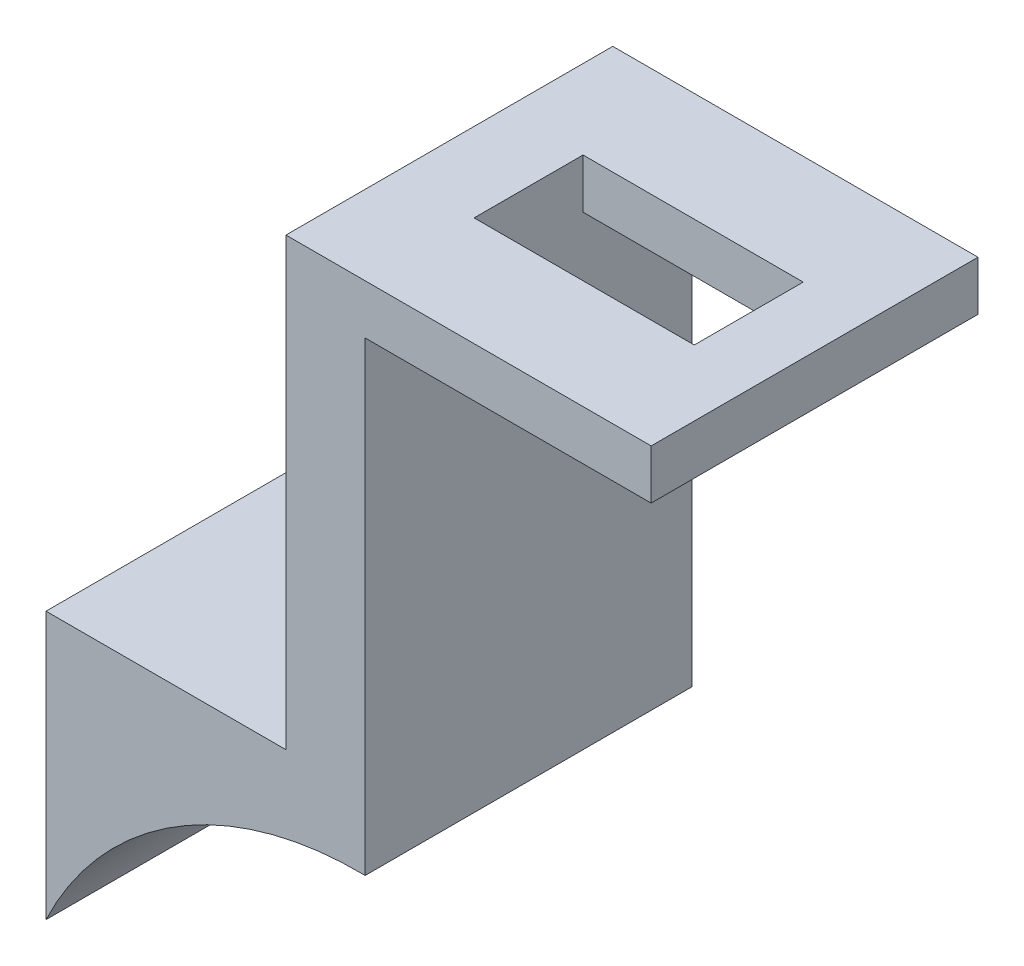
ISO-10303-21;
HEADER;
FILE_DESCRIPTION(('STEP AP214'),'2;1');
FILE_NAME('part.step','',(''),(''),'','','');
FILE_SCHEMA(('AUTOMOTIVE_DESIGN { 1 0 10303 214 1 1 1 1 }'));
ENDSEC;
DATA;
#1=APPLICATION_CONTEXT('core data for automotive mechanical design processes');
#2=APPLICATION_PROTOCOL_DEFINITION('international standard','automotive_design',2000,#1);
#3=PRODUCT_CONTEXT('',#1,'mechanical');
#4=PRODUCT('Part','Part','',(#3));
#5=PRODUCT_RELATED_PRODUCT_CATEGORY('part','',(#4));
#6=PRODUCT_DEFINITION_FORMATION('','',#4);
#7=PRODUCT_DEFINITION_CONTEXT('part definition',#1,'design');
#8=PRODUCT_DEFINITION('design','',#6,#7);
#9=PRODUCT_DEFINITION_SHAPE('','',#8);
#10=(LENGTH_UNIT() NAMED_UNIT(*) SI_UNIT(.MILLI.,.METRE.));
#11=(NAMED_UNIT(*) PLANE_ANGLE_UNIT() SI_UNIT($,.RADIAN.));
#12=(NAMED_UNIT(*) SI_UNIT($,.STERADIAN.) SOLID_ANGLE_UNIT());
#13=UNCERTAINTY_MEASURE_WITH_UNIT(LENGTH_MEASURE(1.E-05),#10,'distance_accuracy_value','');
#14=(GEOMETRIC_REPRESENTATION_CONTEXT(3) GLOBAL_UNCERTAINTY_ASSIGNED_CONTEXT((#13)) GLOBAL_UNIT_ASSIGNED_CONTEXT((#10,
#11,#12)) REPRESENTATION_CONTEXT('',''));
#15=CARTESIAN_POINT('',(0.,0.,0.));
#16=DIRECTION('',(0.,0.,1.));
#17=DIRECTION('',(1.,0.,0.));
#18=AXIS2_PLACEMENT_3D('',#15,#16,#17);
#19=CARTESIAN_POINT('',(16.5480401789836,14.1976842754044,33.));
#20=DIRECTION('',(0.,1.,0.));
#21=DIRECTION('',(-1.,0.,0.));
#22=AXIS2_PLACEMENT_3D('',#19,#20,#21);
#23=PLANE('',#22);
#24=DIRECTION('',(-1.,0.,0.));
#25=VECTOR('',#24,1.);
#26=CARTESIAN_POINT('',(16.5480401789836,14.1976842754044,22.));
#27=LINE('',#26,#25);
#28=CARTESIAN_POINT('',(9.90054017898359,14.1976842754044,22.));
#29=VERTEX_POINT('',#28);
#30=CARTESIAN_POINT('',(-12.3269598210164,14.1976842754044,22.));
#31=VERTEX_POINT('',#30);
#32=EDGE_CURVE('E220',#29,#31,#27,.T.);
#33=ORIENTED_EDGE('',*,*,#32,.F.);
#34=DIRECTION('',(0.,0.,1.));
#35=VECTOR('',#34,1.);
#36=CARTESIAN_POINT('',(9.90054017898359,14.1976842754044,33.));
#37=LINE('',#36,#35);
#38=CARTESIAN_POINT('',(9.90054017898359,14.1976842754044,11.));
#39=VERTEX_POINT('',#38);
#40=EDGE_CURVE('E231',#39,#29,#37,.T.);
#41=ORIENTED_EDGE('',*,*,#40,.F.);
#42=DIRECTION('',(1.,0.,0.));
#43=VECTOR('',#42,1.);
#44=CARTESIAN_POINT('',(16.5480401789836,14.1976842754044,11.));
#45=LINE('',#44,#43);
#46=CARTESIAN_POINT('',(-12.3269598210164,14.1976842754044,11.));
#47=VERTEX_POINT('',#46);
#48=EDGE_CURVE('E221',#47,#39,#45,.T.);
#49=ORIENTED_EDGE('',*,*,#48,.F.);
#50=DIRECTION('',(0.,0.,-1.));
#51=VECTOR('',#50,1.);
#52=CARTESIAN_POINT('',(-12.3269598210164,14.1976842754044,33.));
#53=LINE('',#52,#51);
#54=CARTESIAN_POINT('',(-12.3269598210164,14.1976842754044,0.));
#55=VERTEX_POINT('',#54);
#56=EDGE_CURVE('E191',#47,#55,#53,.T.);
#57=ORIENTED_EDGE('',*,*,#56,.T.);
#58=DIRECTION('',(1.,0.,0.));
#59=VECTOR('',#58,1.);
#60=CARTESIAN_POINT('',(16.5480401789836,14.1976842754044,0.));
#61=LINE('',#60,#59);
#62=CARTESIAN_POINT('',(16.5480401789836,14.1976842754044,0.));
#63=VERTEX_POINT('',#62);
#64=EDGE_CURVE('E170',#55,#63,#61,.T.);
#65=ORIENTED_EDGE('',*,*,#64,.T.);
#66=DIRECTION('',(0.,0.,-1.));
#67=VECTOR('',#66,1.);
#68=CARTESIAN_POINT('',(16.5480401789836,14.1976842754044,33.));
#69=LINE('',#68,#67);
#70=CARTESIAN_POINT('',(16.5480401789836,14.1976842754044,33.));
#71=VERTEX_POINT('',#70);
#72=EDGE_CURVE('E188',#71,#63,#69,.T.);
#73=ORIENTED_EDGE('',*,*,#72,.F.);
#74=DIRECTION('',(1.,0.,0.));
#75=VECTOR('',#74,1.);
#76=CARTESIAN_POINT('',(16.5480401789836,14.1976842754044,33.));
#77=LINE('',#76,#75);
#78=CARTESIAN_POINT('',(-12.3269598210164,14.1976842754044,33.));
#79=VERTEX_POINT('',#78);
#80=EDGE_CURVE('E248',#79,#71,#77,.T.);
#81=ORIENTED_EDGE('',*,*,#80,.F.);
#82=EDGE_CURVE('E166',#79,#31,#53,.T.);
#83=ORIENTED_EDGE('',*,*,#82,.T.);
#84=EDGE_LOOP('',(#33,#41,#49,#57,#65,#73,#81,#83));
#85=FACE_BOUND('',#84,.T.);
#86=ADVANCED_FACE('F33',(#85),#23,.F.);
#87=CARTESIAN_POINT('',(-20.3269598210164,19.1976842754044,33.));
#88=DIRECTION('',(0.,-1.,0.));
#89=DIRECTION('',(0.,0.,-1.));
#90=AXIS2_PLACEMENT_3D('',#87,#88,#89);
#91=PLANE('',#90);
#92=DIRECTION('',(-1.,0.,0.));
#93=VECTOR('',#92,1.);
#94=CARTESIAN_POINT('',(-20.3269598210164,19.1976842754044,0.));
#95=LINE('',#94,#93);
#96=CARTESIAN_POINT('',(16.5480401789836,19.1976842754044,0.));
#97=VERTEX_POINT('',#96);
#98=CARTESIAN_POINT('',(-20.3269598210164,19.1976842754044,0.));
#99=VERTEX_POINT('',#98);
#100=EDGE_CURVE('E177',#97,#99,#95,.T.);
#101=ORIENTED_EDGE('',*,*,#100,.T.);
#102=DIRECTION('',(0.,0.,-1.));
#103=VECTOR('',#102,1.);
#104=CARTESIAN_POINT('',(-20.3269598210164,19.1976842754044,33.));
#105=LINE('',#104,#103);
#106=CARTESIAN_POINT('',(-20.3269598210164,19.1976842754044,33.));
#107=VERTEX_POINT('',#106);
#108=EDGE_CURVE('E181',#107,#99,#105,.T.);
#109=ORIENTED_EDGE('',*,*,#108,.F.);
#110=DIRECTION('',(-1.,0.,0.));
#111=VECTOR('',#110,1.);
#112=CARTESIAN_POINT('',(-20.3269598210164,19.1976842754044,33.));
#113=LINE('',#112,#111);
#114=CARTESIAN_POINT('',(16.5480401789836,19.1976842754044,33.));
#115=VERTEX_POINT('',#114);
#116=EDGE_CURVE('E185',#115,#107,#113,.T.);
#117=ORIENTED_EDGE('',*,*,#116,.F.);
#118=DIRECTION('',(0.,0.,-1.));
#119=VECTOR('',#118,1.);
#120=CARTESIAN_POINT('',(16.5480401789836,19.1976842754044,33.));
#121=LINE('',#120,#119);
#122=EDGE_CURVE('E184',#115,#97,#121,.T.);
#123=ORIENTED_EDGE('',*,*,#122,.T.);
#124=EDGE_LOOP('',(#101,#109,#117,#123));
#125=FACE_BOUND('',#124,.T.);
#126=DIRECTION('',(0.,0.,1.));
#127=VECTOR('',#126,1.);
#128=CARTESIAN_POINT('',(-12.3269598210164,19.1976842754044,33.));
#129=LINE('',#128,#127);
#130=CARTESIAN_POINT('',(-12.3269598210164,19.1976842754044,11.));
#131=VERTEX_POINT('',#130);
#132=CARTESIAN_POINT('',(-12.3269598210164,19.1976842754044,22.));
#133=VERTEX_POINT('',#132);
#134=EDGE_CURVE('E134',#131,#133,#129,.T.);
#135=ORIENTED_EDGE('',*,*,#134,.F.);
#136=DIRECTION('',(-1.,0.,0.));
#137=VECTOR('',#136,1.);
#138=CARTESIAN_POINT('',(-20.3269598210164,19.1976842754044,11.));
#139=LINE('',#138,#137);
#140=CARTESIAN_POINT('',(9.90054017898358,19.1976842754044,11.));
#141=VERTEX_POINT('',#140);
#142=EDGE_CURVE('E201',#141,#131,#139,.T.);
#143=ORIENTED_EDGE('',*,*,#142,.F.);
#144=DIRECTION('',(0.,0.,-1.));
#145=VECTOR('',#144,1.);
#146=CARTESIAN_POINT('',(9.90054017898359,19.1976842754044,33.));
#147=LINE('',#146,#145);
#148=CARTESIAN_POINT('',(9.90054017898359,19.1976842754044,22.));
#149=VERTEX_POINT('',#148);
#150=EDGE_CURVE('E203',#149,#141,#147,.T.);
#151=ORIENTED_EDGE('',*,*,#150,.F.);
#152=DIRECTION('',(1.,0.,0.));
#153=VECTOR('',#152,1.);
#154=CARTESIAN_POINT('',(-20.3269598210164,19.1976842754044,22.));
#155=LINE('',#154,#153);
#156=EDGE_CURVE('E206',#133,#149,#155,.T.);
#157=ORIENTED_EDGE('',*,*,#156,.F.);
#158=EDGE_LOOP('',(#135,#143,#151,#157));
#159=FACE_BOUND('',#158,.T.);
#160=ADVANCED_FACE('F225',(#125,#159),#91,.F.);
#161=CARTESIAN_POINT('',(-20.3269598210164,14.1976842754044,33.));
#162=DIRECTION('',(1.,0.,0.));
#163=DIRECTION('',(0.,1.,0.));
#164=AXIS2_PLACEMENT_3D('',#161,#162,#163);
#165=PLANE('',#164);
#166=DIRECTION('',(0.,-1.,0.));
#167=VECTOR('',#166,1.);
#168=CARTESIAN_POINT('',(-20.3269598210164,14.1976842754044,0.));
#169=LINE('',#168,#167);
#170=CARTESIAN_POINT('',(-20.3269598210164,-25.8023157245956,0.));
#171=VERTEX_POINT('',#170);
#172=EDGE_CURVE('E239',#99,#171,#169,.T.);
#173=ORIENTED_EDGE('',*,*,#172,.T.);
#174=DIRECTION('',(0.,0.,-1.));
#175=VECTOR('',#174,1.);
#176=CARTESIAN_POINT('',(-20.3269598210164,-25.8023157245956,33.));
#177=LINE('',#176,#175);
#178=CARTESIAN_POINT('',(-20.3269598210164,-25.8023157245956,33.));
#179=VERTEX_POINT('',#178);
#180=EDGE_CURVE('E198',#179,#171,#177,.T.);
#181=ORIENTED_EDGE('',*,*,#180,.F.);
#182=DIRECTION('',(0.,-1.,0.));
#183=VECTOR('',#182,1.);
#184=CARTESIAN_POINT('',(-20.3269598210164,19.1976842754044,33.));
#185=LINE('',#184,#183);
#186=EDGE_CURVE('E180',#107,#179,#185,.T.);
#187=ORIENTED_EDGE('',*,*,#186,.F.);
#188=ORIENTED_EDGE('',*,*,#108,.T.);
#189=EDGE_LOOP('',(#173,#181,#187,#188));
#190=FACE_BOUND('',#189,.T.);
#191=ADVANCED_FACE('F35',(#190),#165,.F.);
#192=CARTESIAN_POINT('',(-20.3269598210164,-25.8023157245956,33.));
#193=DIRECTION('',(0.,-1.,0.));
#194=DIRECTION('',(1.,0.,0.));
#195=AXIS2_PLACEMENT_3D('',#192,#193,#194);
#196=PLANE('',#195);
#197=DIRECTION('',(-1.,0.,0.));
#198=VECTOR('',#197,1.);
#199=CARTESIAN_POINT('',(-20.3269598210164,-25.8023157245956,0.));
#200=LINE('',#199,#198);
#201=CARTESIAN_POINT('',(-44.5519598210164,-25.8023157245956,0.));
#202=VERTEX_POINT('',#201);
#203=EDGE_CURVE('E254',#171,#202,#200,.T.);
#204=ORIENTED_EDGE('',*,*,#203,.T.);
#205=DIRECTION('',(0.,0.,-1.));
#206=VECTOR('',#205,1.);
#207=CARTESIAN_POINT('',(-44.5519598210164,-25.8023157245956,33.));
#208=LINE('',#207,#206);
#209=CARTESIAN_POINT('',(-44.5519598210164,-25.8023157245956,33.));
#210=VERTEX_POINT('',#209);
#211=EDGE_CURVE('E195',#210,#202,#208,.T.);
#212=ORIENTED_EDGE('',*,*,#211,.F.);
#213=DIRECTION('',(-1.,0.,0.));
#214=VECTOR('',#213,1.);
#215=CARTESIAN_POINT('',(-20.3269598210164,-25.8023157245956,33.));
#216=LINE('',#215,#214);
#217=EDGE_CURVE('E241',#179,#210,#216,.T.);
#218=ORIENTED_EDGE('',*,*,#217,.F.);
#219=ORIENTED_EDGE('',*,*,#180,.T.);
#220=EDGE_LOOP('',(#204,#212,#218,#219));
#221=FACE_BOUND('',#220,.T.);
#222=ADVANCED_FACE('F261',(#221),#196,.F.);
#223=CARTESIAN_POINT('',(-44.5519598210164,-25.8023157245956,33.));
#224=DIRECTION('',(1.,0.,0.));
#225=DIRECTION('',(0.,0.,-1.));
#226=AXIS2_PLACEMENT_3D('',#223,#224,#225);
#227=PLANE('',#226);
#228=CARTESIAN_POINT('',(-44.5519598210164,-40.7773157245956,16.5));
#229=DIRECTION('',(-1.,0.,0.));
#230=DIRECTION('',(0.,0.,1.));
#231=AXIS2_PLACEMENT_3D('',#228,#229,#230);
#232=CIRCLE('',#231,1.5);
#233=CARTESIAN_POINT('',(-44.5519598210164,-40.7773157245956,18.));
#234=VERTEX_POINT('',#233);
#235=EDGE_CURVE('E137',#234,#234,#232,.T.);
#236=ORIENTED_EDGE('',*,*,#235,.F.);
#237=EDGE_LOOP('',(#236));
#238=FACE_BOUND('',#237,.T.);
#239=CARTESIAN_POINT('',(-44.5519598210164,-30.7773157245956,16.5));
#240=DIRECTION('',(-1.,0.,0.));
#241=DIRECTION('',(0.,0.,1.));
#242=AXIS2_PLACEMENT_3D('',#239,#240,#241);
#243=CIRCLE('',#242,1.5);
#244=CARTESIAN_POINT('',(-44.5519598210164,-30.7773157245956,18.));
#245=VERTEX_POINT('',#244);
#246=EDGE_CURVE('E389',#245,#245,#243,.T.);
#247=ORIENTED_EDGE('',*,*,#246,.F.);
#248=EDGE_LOOP('',(#247));
#249=FACE_BOUND('',#248,.T.);
#250=DIRECTION('',(0.,-1.,0.));
#251=VECTOR('',#250,1.);
#252=CARTESIAN_POINT('',(-44.5519598210164,-25.8023157245956,0.));
#253=LINE('',#252,#251);
#254=CARTESIAN_POINT('',(-44.5519598210164,-52.7773157245956,0.));
#255=VERTEX_POINT('',#254);
#256=EDGE_CURVE('E158',#202,#255,#253,.T.);
#257=ORIENTED_EDGE('',*,*,#256,.T.);
#258=DIRECTION('',(0.,0.,-1.));
#259=VECTOR('',#258,1.);
#260=CARTESIAN_POINT('',(-44.5519598210164,-52.7773157245956,33.));
#261=LINE('',#260,#259);
#262=CARTESIAN_POINT('',(-44.5519598210164,-52.7773157245956,33.));
#263=VERTEX_POINT('',#262);
#264=EDGE_CURVE('E153',#263,#255,#261,.T.);
#265=ORIENTED_EDGE('',*,*,#264,.F.);
#266=DIRECTION('',(0.,-1.,0.));
#267=VECTOR('',#266,1.);
#268=CARTESIAN_POINT('',(-44.5519598210164,-25.8023157245956,33.));
#269=LINE('',#268,#267);
#270=EDGE_CURVE('E243',#210,#263,#269,.T.);
#271=ORIENTED_EDGE('',*,*,#270,.F.);
#272=ORIENTED_EDGE('',*,*,#211,.T.);
#273=EDGE_LOOP('',(#257,#265,#271,#272));
#274=FACE_BOUND('',#273,.T.);
#275=ADVANCED_FACE('F143',(#238,#249,#274),#227,.F.);
#276=CARTESIAN_POINT('',(-12.9385147176768,-67.7969724682811,33.));
#277=DIRECTION('',(0.,0.,-1.));
#278=DIRECTION('',(-1.,0.,0.));
#279=AXIS2_PLACEMENT_3D('',#276,#277,#278);
#280=CYLINDRICAL_SURFACE('',#279,35.);
#281=DIRECTION('',(0.,0.,-1.));
#282=VECTOR('',#281,1.);
#283=CARTESIAN_POINT('',(-36.5519598210164,-41.9627856153614,33.));
#284=LINE('',#283,#282);
#285=CARTESIAN_POINT('',(-36.5519598210164,-41.9627856153614,15.5809455195214));
#286=VERTEX_POINT('',#285);
#287=CARTESIAN_POINT('',(-36.5519598210164,-41.9627856153614,17.4190544804786));
#288=VERTEX_POINT('',#287);
#289=EDGE_CURVE('E47',#286,#288,#284,.F.);
#290=ORIENTED_EDGE('',*,*,#289,.F.);
#291=CARTESIAN_POINT('',(-36.5519598210164,-41.9627856153614,15.5809455195214));
#292=CARTESIAN_POINT('',(-36.5933295367311,-42.0005933906776,15.6296848237225));
#293=CARTESIAN_POINT('',(-36.6324063152667,-42.0364996907044,15.6822478855097));
#294=CARTESIAN_POINT('',(-36.704630973327,-42.1031193513577,15.7953068602361));
#295=CARTESIAN_POINT('',(-36.7377053147251,-42.1337680789467,15.8558872344583));
#296=CARTESIAN_POINT('',(-36.7957560272317,-42.1877232553523,15.9845928300745));
#297=CARTESIAN_POINT('',(-36.8206717658004,-42.210974694834,16.0527697101519));
#298=CARTESIAN_POINT('',(-36.8598958775383,-42.2476425842222,16.1943248207159));
#299=CARTESIAN_POINT('',(-36.8742581245115,-42.2611089811462,16.2676745092339));
#300=CARTESIAN_POINT('',(-36.8898525707757,-42.2757360352432,16.4059514786441));
#301=CARTESIAN_POINT('',(-36.8926998768241,-42.2784102775565,16.4705386844908));
#302=CARTESIAN_POINT('',(-36.8895011846052,-42.2754079775097,16.5993075992439));
#303=CARTESIAN_POINT('',(-36.8834550409306,-42.2697312986126,16.6634893015032));
#304=CARTESIAN_POINT('',(-36.8639960367715,-42.2514935607524,16.7830091012613));
#305=CARTESIAN_POINT('',(-36.8513700261312,-42.2396680903098,16.8385944414537));
#306=CARTESIAN_POINT('',(-36.8200399423233,-42.2103897288161,16.9465846223572));
#307=CARTESIAN_POINT('',(-36.8013218723589,-42.1929238794496,16.9989818058884));
#308=CARTESIAN_POINT('',(-36.7503443804932,-42.1454933827767,17.1194942653719));
#309=CARTESIAN_POINT('',(-36.7156543318281,-42.1133144350175,17.1856910768415));
#310=CARTESIAN_POINT('',(-36.6388153393149,-42.0423892051685,17.3091076620255));
#311=CARTESIAN_POINT('',(-36.5967119123332,-42.0036830569903,17.366378410195));
#312=CARTESIAN_POINT('',(-36.5519598210164,-41.9627856153614,17.4190544804786));
#313=B_SPLINE_CURVE_WITH_KNOTS('',3,(#291,#292,#293,#294,#295,#296,#297,#298,#299,#300,#301,
#302,#303,#304,#305,#306,#307,#308,#309,#310,#311,#312),.UNSPECIFIED.,.F.,.F.,(4,2,2,2,2,2,2,2,
2,2,4),(0.,0.223069024788523,0.448709480819663,0.675990664394192,0.902103398511067,
1.09509566262022,1.28809108217592,1.46201857333442,1.63634852598818,1.8792105600151,
2.12063039346675),.UNSPECIFIED.);
#314=EDGE_CURVE('E11',#286,#288,#313,.T.);
#315=ORIENTED_EDGE('',*,*,#314,.T.);
#316=EDGE_LOOP('',(#290,#315));
#317=FACE_BOUND('',#316,.T.);
#318=CARTESIAN_POINT('',(-12.9385147176768,-67.7969724682811,0.));
#319=DIRECTION('',(0.,0.,-1.));
#320=DIRECTION('',(-1.,0.,0.));
#321=AXIS2_PLACEMENT_3D('',#318,#319,#320);
#322=CIRCLE('',#321,35.);
#323=CARTESIAN_POINT('',(-12.3269598210164,-32.8023157245956,0.));
#324=VERTEX_POINT('',#323);
#325=EDGE_CURVE('E147',#255,#324,#322,.T.);
#326=ORIENTED_EDGE('',*,*,#325,.T.);
#327=DIRECTION('',(0.,0.,-1.));
#328=VECTOR('',#327,1.);
#329=CARTESIAN_POINT('',(-12.3269598210164,-32.8023157245956,33.));
#330=LINE('',#329,#328);
#331=CARTESIAN_POINT('',(-12.3269598210164,-32.8023157245956,33.));
#332=VERTEX_POINT('',#331);
#333=EDGE_CURVE('E150',#332,#324,#330,.T.);
#334=ORIENTED_EDGE('',*,*,#333,.F.);
#335=CARTESIAN_POINT('',(-12.9385147176768,-67.7969724682811,33.));
#336=DIRECTION('',(0.,0.,-1.));
#337=DIRECTION('',(-1.,0.,0.));
#338=AXIS2_PLACEMENT_3D('',#335,#336,#337);
#339=CIRCLE('',#338,35.);
#340=EDGE_CURVE('E245',#263,#332,#339,.T.);
#341=ORIENTED_EDGE('',*,*,#340,.F.);
#342=ORIENTED_EDGE('',*,*,#264,.T.);
#343=EDGE_LOOP('',(#326,#334,#341,#342));
#344=FACE_BOUND('',#343,.T.);
#345=ADVANCED_FACE('F139',(#317,#344),#280,.F.);
#346=CARTESIAN_POINT('',(-12.3269598210164,-32.8023157245956,33.));
#347=DIRECTION('',(-1.,0.,0.));
#348=DIRECTION('',(0.,-1.,0.));
#349=AXIS2_PLACEMENT_3D('',#346,#347,#348);
#350=PLANE('',#349);
#351=ORIENTED_EDGE('',*,*,#56,.F.);
#352=DIRECTION('',(0.,-1.,0.));
#353=VECTOR('',#352,1.);
#354=CARTESIAN_POINT('',(-12.3269598210164,19.1976962754044,11.));
#355=LINE('',#354,#353);
#356=EDGE_CURVE('E61',#131,#47,#355,.T.);
#357=ORIENTED_EDGE('',*,*,#356,.F.);
#358=ORIENTED_EDGE('',*,*,#134,.T.);
#359=DIRECTION('',(0.,-1.,0.));
#360=VECTOR('',#359,1.);
#361=CARTESIAN_POINT('',(-12.3269598210164,19.1976962754044,22.));
#362=LINE('',#361,#360);
#363=EDGE_CURVE('E211',#133,#31,#362,.T.);
#364=ORIENTED_EDGE('',*,*,#363,.T.);
#365=ORIENTED_EDGE('',*,*,#82,.F.);
#366=DIRECTION('',(0.,1.,0.));
#367=VECTOR('',#366,1.);
#368=CARTESIAN_POINT('',(-12.3269598210164,-32.8023157245956,33.));
#369=LINE('',#368,#367);
#370=EDGE_CURVE('E165',#332,#79,#369,.T.);
#371=ORIENTED_EDGE('',*,*,#370,.F.);
#372=ORIENTED_EDGE('',*,*,#333,.T.);
#373=DIRECTION('',(0.,1.,0.));
#374=VECTOR('',#373,1.);
#375=CARTESIAN_POINT('',(-12.3269598210164,-32.8023157245956,0.));
#376=LINE('',#375,#374);
#377=EDGE_CURVE('E157',#324,#55,#376,.T.);
#378=ORIENTED_EDGE('',*,*,#377,.T.);
#379=EDGE_LOOP('',(#351,#357,#358,#364,#365,#371,#372,#378));
#380=FACE_BOUND('',#379,.T.);
#381=ADVANCED_FACE('F142',(#380),#350,.F.);
#382=CARTESIAN_POINT('',(16.5480401789836,19.1976842754044,33.));
#383=DIRECTION('',(-1.,0.,0.));
#384=DIRECTION('',(0.,0.,1.));
#385=AXIS2_PLACEMENT_3D('',#382,#383,#384);
#386=PLANE('',#385);
#387=DIRECTION('',(0.,1.,0.));
#388=VECTOR('',#387,1.);
#389=CARTESIAN_POINT('',(16.5480401789836,19.1976842754044,0.));
#390=LINE('',#389,#388);
#391=EDGE_CURVE('E172',#63,#97,#390,.T.);
#392=ORIENTED_EDGE('',*,*,#391,.T.);
#393=ORIENTED_EDGE('',*,*,#122,.F.);
#394=DIRECTION('',(0.,1.,0.));
#395=VECTOR('',#394,1.);
#396=CARTESIAN_POINT('',(16.5480401789836,19.1976842754044,33.));
#397=LINE('',#396,#395);
#398=EDGE_CURVE('E250',#71,#115,#397,.T.);
#399=ORIENTED_EDGE('',*,*,#398,.F.);
#400=ORIENTED_EDGE('',*,*,#72,.T.);
#401=EDGE_LOOP('',(#392,#393,#399,#400));
#402=FACE_BOUND('',#401,.T.);
#403=ADVANCED_FACE('F271',(#402),#386,.F.);
#404=CARTESIAN_POINT('',(-12.9385147176768,-67.7969724682811,33.));
#405=DIRECTION('',(0.,0.,-1.));
#406=DIRECTION('',(-1.,0.,0.));
#407=AXIS2_PLACEMENT_3D('',#404,#405,#406);
#408=PLANE('',#407);
#409=ORIENTED_EDGE('',*,*,#186,.T.);
#410=ORIENTED_EDGE('',*,*,#217,.T.);
#411=ORIENTED_EDGE('',*,*,#270,.T.);
#412=ORIENTED_EDGE('',*,*,#340,.T.);
#413=ORIENTED_EDGE('',*,*,#370,.T.);
#414=ORIENTED_EDGE('',*,*,#80,.T.);
#415=ORIENTED_EDGE('',*,*,#398,.T.);
#416=ORIENTED_EDGE('',*,*,#116,.T.);
#417=EDGE_LOOP('',(#409,#410,#411,#412,#413,#414,#415,#416));
#418=FACE_BOUND('',#417,.T.);
#419=ADVANCED_FACE('F411',(#418),#408,.F.);
#420=CARTESIAN_POINT('',(-12.9385147176768,-67.7969724682811,0.));
#421=DIRECTION('',(0.,0.,-1.));
#422=DIRECTION('',(-1.,0.,0.));
#423=AXIS2_PLACEMENT_3D('',#420,#421,#422);
#424=PLANE('',#423);
#425=ORIENTED_EDGE('',*,*,#172,.F.);
#426=ORIENTED_EDGE('',*,*,#100,.F.);
#427=ORIENTED_EDGE('',*,*,#391,.F.);
#428=ORIENTED_EDGE('',*,*,#64,.F.);
#429=ORIENTED_EDGE('',*,*,#377,.F.);
#430=ORIENTED_EDGE('',*,*,#325,.F.);
#431=ORIENTED_EDGE('',*,*,#256,.F.);
#432=ORIENTED_EDGE('',*,*,#203,.F.);
#433=EDGE_LOOP('',(#425,#426,#427,#428,#429,#430,#431,#432));
#434=FACE_BOUND('',#433,.T.);
#435=ADVANCED_FACE('F168',(#434),#424,.T.);
#436=CARTESIAN_POINT('',(9.90054017898359,19.1976962754044,22.));
#437=DIRECTION('',(0.,0.,-1.));
#438=DIRECTION('',(-1.,0.,0.));
#439=AXIS2_PLACEMENT_3D('',#436,#437,#438);
#440=PLANE('',#439);
#441=ORIENTED_EDGE('',*,*,#32,.T.);
#442=ORIENTED_EDGE('',*,*,#363,.F.);
#443=ORIENTED_EDGE('',*,*,#156,.T.);
#444=DIRECTION('',(0.,-1.,0.));
#445=VECTOR('',#444,1.);
#446=CARTESIAN_POINT('',(9.90054017898359,19.1976962754044,22.));
#447=LINE('',#446,#445);
#448=EDGE_CURVE('E222',#149,#29,#447,.T.);
#449=ORIENTED_EDGE('',*,*,#448,.T.);
#450=EDGE_LOOP('',(#441,#442,#443,#449));
#451=FACE_BOUND('',#450,.T.);
#452=ADVANCED_FACE('F216',(#451),#440,.T.);
#453=CARTESIAN_POINT('',(9.90054017898359,19.1976962754044,11.));
#454=DIRECTION('',(-1.,0.,0.));
#455=DIRECTION('',(0.,0.,1.));
#456=AXIS2_PLACEMENT_3D('',#453,#454,#455);
#457=PLANE('',#456);
#458=ORIENTED_EDGE('',*,*,#40,.T.);
#459=ORIENTED_EDGE('',*,*,#448,.F.);
#460=ORIENTED_EDGE('',*,*,#150,.T.);
#461=DIRECTION('',(0.,-1.,0.));
#462=VECTOR('',#461,1.);
#463=CARTESIAN_POINT('',(9.90054017898359,19.1976962754044,11.));
#464=LINE('',#463,#462);
#465=EDGE_CURVE('E229',#141,#39,#464,.T.);
#466=ORIENTED_EDGE('',*,*,#465,.T.);
#467=EDGE_LOOP('',(#458,#459,#460,#466));
#468=FACE_BOUND('',#467,.T.);
#469=ADVANCED_FACE('F228',(#468),#457,.T.);
#470=CARTESIAN_POINT('',(-12.3269598210164,19.1976962754044,11.));
#471=DIRECTION('',(0.,0.,1.));
#472=DIRECTION('',(1.,0.,0.));
#473=AXIS2_PLACEMENT_3D('',#470,#471,#472);
#474=PLANE('',#473);
#475=ORIENTED_EDGE('',*,*,#48,.T.);
#476=ORIENTED_EDGE('',*,*,#465,.F.);
#477=ORIENTED_EDGE('',*,*,#142,.T.);
#478=ORIENTED_EDGE('',*,*,#356,.T.);
#479=EDGE_LOOP('',(#475,#476,#477,#478));
#480=FACE_BOUND('',#479,.T.);
#481=ADVANCED_FACE('F276',(#480),#474,.T.);
#482=CARTESIAN_POINT('',(-36.5519598210164,-40.7773157245956,16.5));
#483=DIRECTION('',(-1.,0.,0.));
#484=DIRECTION('',(0.,0.,1.));
#485=AXIS2_PLACEMENT_3D('',#482,#483,#484);
#486=CYLINDRICAL_SURFACE('',#485,1.5);
#487=ORIENTED_EDGE('',*,*,#235,.T.);
#488=EDGE_LOOP('',(#487));
#489=FACE_BOUND('',#488,.T.);
#490=CARTESIAN_POINT('',(-36.5519598210164,-40.7773157245956,16.5));
#491=DIRECTION('',(-1.,0.,0.));
#492=DIRECTION('',(0.,0.,1.));
#493=AXIS2_PLACEMENT_3D('',#490,#491,#492);
#494=CIRCLE('',#493,1.5);
#495=EDGE_CURVE('E53',#288,#286,#494,.T.);
#496=ORIENTED_EDGE('',*,*,#495,.F.);
#497=ORIENTED_EDGE('',*,*,#314,.F.);
#498=EDGE_LOOP('',(#496,#497));
#499=FACE_BOUND('',#498,.T.);
#500=ADVANCED_FACE('F136',(#489,#499),#486,.F.);
#501=CARTESIAN_POINT('',(-36.5519598210164,-40.7773157245956,16.5));
#502=DIRECTION('',(-1.,0.,0.));
#503=DIRECTION('',(0.,0.,1.));
#504=AXIS2_PLACEMENT_3D('',#501,#502,#503);
#505=PLANE('',#504);
#506=ORIENTED_EDGE('',*,*,#289,.T.);
#507=ORIENTED_EDGE('',*,*,#495,.T.);
#508=EDGE_LOOP('',(#506,#507));
#509=FACE_BOUND('',#508,.T.);
#510=ADVANCED_FACE('F132',(#509),#505,.T.);
#511=CARTESIAN_POINT('',(-36.5519598210164,-30.7773157245956,16.5));
#512=DIRECTION('',(-1.,0.,0.));
#513=DIRECTION('',(0.,0.,1.));
#514=AXIS2_PLACEMENT_3D('',#511,#512,#513);
#515=CYLINDRICAL_SURFACE('',#514,1.5);
#516=CARTESIAN_POINT('',(-36.5519598210164,-30.7773157245956,16.5));
#517=DIRECTION('',(-1.,0.,0.));
#518=DIRECTION('',(0.,0.,1.));
#519=AXIS2_PLACEMENT_3D('',#516,#517,#518);
#520=CIRCLE('',#519,1.5);
#521=CARTESIAN_POINT('',(-36.5519598210164,-30.7773157245956,18.));
#522=VERTEX_POINT('',#521);
#523=EDGE_CURVE('E388',#522,#522,#520,.T.);
#524=ORIENTED_EDGE('',*,*,#523,.F.);
#525=EDGE_LOOP('',(#524));
#526=FACE_BOUND('',#525,.T.);
#527=ORIENTED_EDGE('',*,*,#246,.T.);
#528=EDGE_LOOP('',(#527));
#529=FACE_BOUND('',#528,.T.);
#530=ADVANCED_FACE('F363',(#526,#529),#515,.F.);
#531=CARTESIAN_POINT('',(-36.5519598210164,-30.7773157245956,16.5));
#532=DIRECTION('',(-1.,0.,0.));
#533=DIRECTION('',(0.,0.,1.));
#534=AXIS2_PLACEMENT_3D('',#531,#532,#533);
#535=PLANE('',#534);
#536=ORIENTED_EDGE('',*,*,#523,.T.);
#537=EDGE_LOOP('',(#536));
#538=FACE_BOUND('',#537,.T.);
#539=ADVANCED_FACE('F372',(#538),#535,.T.);
#540=CLOSED_SHELL('',(#86,#160,#191,#222,#275,#345,#381,#403,#419,#435,#452,#469,#481,#500,#510,
#530,#539));
#541=MANIFOLD_SOLID_BREP('B2',#540);
#542=ADVANCED_BREP_SHAPE_REPRESENTATION('',(#18,#541),#14);
#543=SHAPE_DEFINITION_REPRESENTATION(#9,#542);
ENDSEC;
END-ISO-10303-21;
